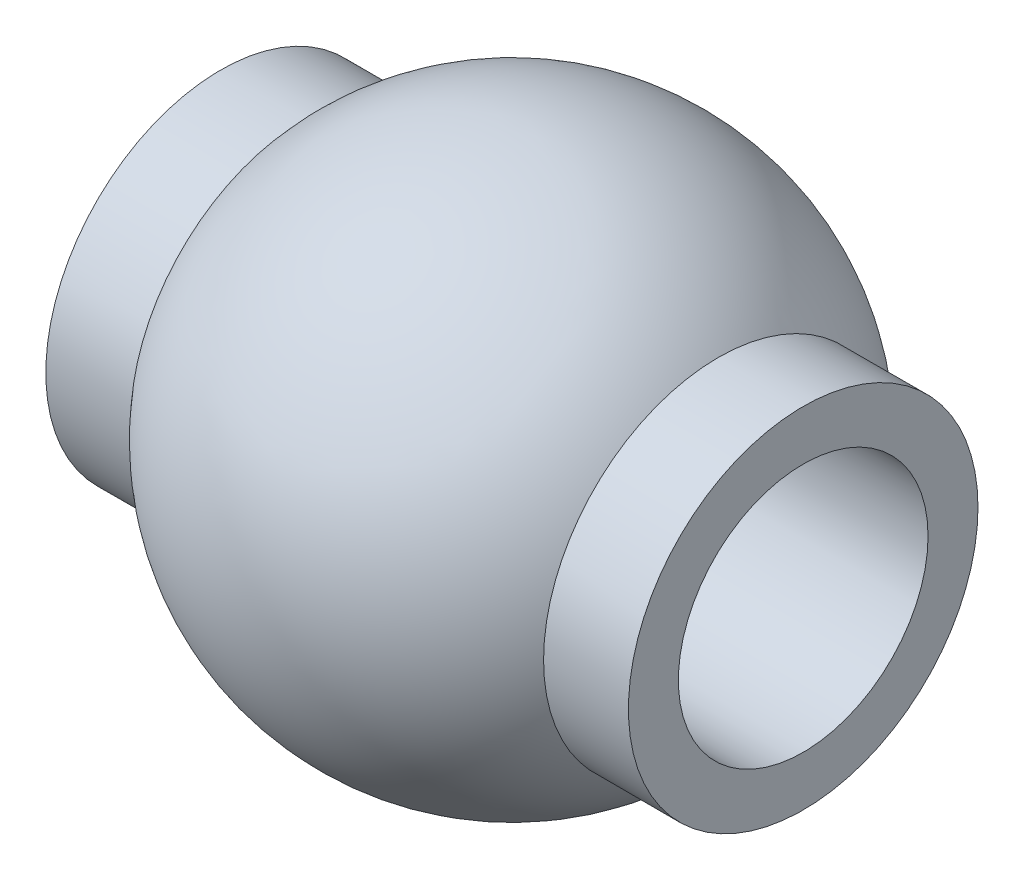
ISO-10303-21;
HEADER;
FILE_DESCRIPTION(('STEP AP214'),'2;1');
FILE_NAME('part.step','',(''),(''),'','','');
FILE_SCHEMA(('AUTOMOTIVE_DESIGN { 1 0 10303 214 1 1 1 1 }'));
ENDSEC;
DATA;
#1=APPLICATION_CONTEXT('core data for automotive mechanical design processes');
#2=APPLICATION_PROTOCOL_DEFINITION('international standard','automotive_design',2000,#1);
#3=PRODUCT_CONTEXT('',#1,'mechanical');
#4=PRODUCT('Part','Part','',(#3));
#5=PRODUCT_RELATED_PRODUCT_CATEGORY('part','',(#4));
#6=PRODUCT_DEFINITION_FORMATION('','',#4);
#7=PRODUCT_DEFINITION_CONTEXT('part definition',#1,'design');
#8=PRODUCT_DEFINITION('design','',#6,#7);
#9=PRODUCT_DEFINITION_SHAPE('','',#8);
#10=(LENGTH_UNIT() NAMED_UNIT(*) SI_UNIT(.MILLI.,.METRE.));
#11=(NAMED_UNIT(*) PLANE_ANGLE_UNIT() SI_UNIT($,.RADIAN.));
#12=(NAMED_UNIT(*) SI_UNIT($,.STERADIAN.) SOLID_ANGLE_UNIT());
#13=UNCERTAINTY_MEASURE_WITH_UNIT(LENGTH_MEASURE(1.E-05),#10,'distance_accuracy_value','');
#14=(GEOMETRIC_REPRESENTATION_CONTEXT(3) GLOBAL_UNCERTAINTY_ASSIGNED_CONTEXT((#13)) GLOBAL_UNIT_ASSIGNED_CONTEXT((#10,
#11,#12)) REPRESENTATION_CONTEXT('',''));
#15=CARTESIAN_POINT('',(0.,0.,0.));
#16=DIRECTION('',(0.,0.,1.));
#17=DIRECTION('',(1.,0.,0.));
#18=AXIS2_PLACEMENT_3D('',#15,#16,#17);
#19=CARTESIAN_POINT('',(0.,0.,0.));
#20=DIRECTION('',(0.,0.,-1.));
#21=DIRECTION('',(1.,0.,0.));
#22=AXIS2_PLACEMENT_3D('',#19,#20,#21);
#23=SPHERICAL_SURFACE('',#22,10.31875);
#24=CARTESIAN_POINT('',(0.,0.,0.));
#25=DIRECTION('',(-1.,0.,0.));
#26=DIRECTION('',(0.,0.,1.));
#27=AXIS2_PLACEMENT_3D('',#24,#25,#26);
#28=SPHERICAL_SURFACE('',#27,10.31875);
#29=CARTESIAN_POINT('',(7.87534413930591,0.,0.));
#30=DIRECTION('',(-1.,0.,0.));
#31=DIRECTION('',(0.,0.,1.));
#32=AXIS2_PLACEMENT_3D('',#29,#30,#31);
#33=CIRCLE('',#32,6.6675);
#34=CARTESIAN_POINT('',(7.87534413930591,0.,6.6675));
#35=VERTEX_POINT('',#34);
#36=EDGE_CURVE('E11',#35,#35,#33,.T.);
#37=ORIENTED_EDGE('',*,*,#36,.T.);
#38=EDGE_LOOP('',(#37));
#39=FACE_BOUND('',#38,.T.);
#40=CARTESIAN_POINT('',(-7.87534413930591,0.,0.));
#41=DIRECTION('',(1.,0.,0.));
#42=DIRECTION('',(0.,0.,-1.));
#43=AXIS2_PLACEMENT_3D('',#40,#41,#42);
#44=CIRCLE('',#43,6.6675);
#45=CARTESIAN_POINT('',(-7.87534413930591,0.,-6.6675));
#46=VERTEX_POINT('',#45);
#47=EDGE_CURVE('E55',#46,#46,#44,.T.);
#48=ORIENTED_EDGE('',*,*,#47,.T.);
#49=EDGE_LOOP('',(#48));
#50=FACE_BOUND('',#49,.T.);
#51=ADVANCED_FACE('F48',(#39,#50),#28,.T.);
#52=CARTESIAN_POINT('',(-11.1125,0.,0.));
#53=DIRECTION('',(1.,0.,0.));
#54=DIRECTION('',(0.,0.,-1.));
#55=AXIS2_PLACEMENT_3D('',#52,#53,#54);
#56=CYLINDRICAL_SURFACE('',#55,6.6675);
#57=CARTESIAN_POINT('',(-11.1125,0.,0.));
#58=DIRECTION('',(1.,0.,0.));
#59=DIRECTION('',(0.,0.,-1.));
#60=AXIS2_PLACEMENT_3D('',#57,#58,#59);
#61=CIRCLE('',#60,6.6675);
#62=CARTESIAN_POINT('',(-11.1125,0.,-6.6675));
#63=VERTEX_POINT('',#62);
#64=EDGE_CURVE('E61',#63,#63,#61,.T.);
#65=ORIENTED_EDGE('',*,*,#64,.T.);
#66=EDGE_LOOP('',(#65));
#67=FACE_BOUND('',#66,.T.);
#68=ORIENTED_EDGE('',*,*,#47,.F.);
#69=EDGE_LOOP('',(#68));
#70=FACE_BOUND('',#69,.T.);
#71=ADVANCED_FACE('F91',(#67,#70),#56,.T.);
#72=CARTESIAN_POINT('',(-11.1125,0.,0.));
#73=DIRECTION('',(1.,0.,0.));
#74=DIRECTION('',(0.,0.,-1.));
#75=AXIS2_PLACEMENT_3D('',#72,#73,#74);
#76=PLANE('',#75);
#77=CARTESIAN_POINT('',(-11.1125,0.,0.));
#78=DIRECTION('',(1.,0.,0.));
#79=DIRECTION('',(0.,0.,-1.));
#80=AXIS2_PLACEMENT_3D('',#77,#78,#79);
#81=CIRCLE('',#80,4.7625);
#82=CARTESIAN_POINT('',(-11.1125,0.,-4.7625));
#83=VERTEX_POINT('',#82);
#84=EDGE_CURVE('E65',#83,#83,#81,.T.);
#85=ORIENTED_EDGE('',*,*,#84,.T.);
#86=EDGE_LOOP('',(#85));
#87=FACE_BOUND('',#86,.T.);
#88=ORIENTED_EDGE('',*,*,#64,.F.);
#89=EDGE_LOOP('',(#88));
#90=FACE_BOUND('',#89,.T.);
#91=ADVANCED_FACE('F95',(#87,#90),#76,.F.);
#92=CARTESIAN_POINT('',(11.1125,0.,0.));
#93=DIRECTION('',(1.,0.,0.));
#94=DIRECTION('',(0.,0.,-1.));
#95=AXIS2_PLACEMENT_3D('',#92,#93,#94);
#96=CIRCLE('',#95,6.6675);
#97=CARTESIAN_POINT('',(11.1125,0.,-6.6675));
#98=VERTEX_POINT('',#97);
#99=EDGE_CURVE('E70',#98,#98,#96,.T.);
#100=ORIENTED_EDGE('',*,*,#99,.F.);
#101=EDGE_LOOP('',(#100));
#102=FACE_BOUND('',#101,.T.);
#103=ORIENTED_EDGE('',*,*,#36,.F.);
#104=EDGE_LOOP('',(#103));
#105=FACE_BOUND('',#104,.T.);
#106=ADVANCED_FACE('F88',(#102,#105),#56,.T.);
#107=CARTESIAN_POINT('',(-11.1125,0.,0.));
#108=DIRECTION('',(1.,0.,0.));
#109=DIRECTION('',(0.,0.,-1.));
#110=AXIS2_PLACEMENT_3D('',#107,#108,#109);
#111=CYLINDRICAL_SURFACE('',#110,4.7625);
#112=CARTESIAN_POINT('',(11.1125,0.,0.));
#113=DIRECTION('',(1.,0.,0.));
#114=DIRECTION('',(0.,0.,-1.));
#115=AXIS2_PLACEMENT_3D('',#112,#113,#114);
#116=CIRCLE('',#115,4.7625);
#117=CARTESIAN_POINT('',(11.1125,0.,-4.7625));
#118=VERTEX_POINT('',#117);
#119=EDGE_CURVE('E73',#118,#118,#116,.T.);
#120=ORIENTED_EDGE('',*,*,#119,.T.);
#121=EDGE_LOOP('',(#120));
#122=FACE_BOUND('',#121,.T.);
#123=ORIENTED_EDGE('',*,*,#84,.F.);
#124=EDGE_LOOP('',(#123));
#125=FACE_BOUND('',#124,.T.);
#126=ADVANCED_FACE('F78',(#122,#125),#111,.F.);
#127=CARTESIAN_POINT('',(11.1125,0.,0.));
#128=DIRECTION('',(1.,0.,0.));
#129=DIRECTION('',(0.,0.,-1.));
#130=AXIS2_PLACEMENT_3D('',#127,#128,#129);
#131=PLANE('',#130);
#132=ORIENTED_EDGE('',*,*,#99,.T.);
#133=EDGE_LOOP('',(#132));
#134=FACE_BOUND('',#133,.T.);
#135=ORIENTED_EDGE('',*,*,#119,.F.);
#136=EDGE_LOOP('',(#135));
#137=FACE_BOUND('',#136,.T.);
#138=ADVANCED_FACE('F81',(#134,#137),#131,.T.);
#139=CLOSED_SHELL('',(#51,#71,#91,#106,#126,#138));
#140=MANIFOLD_SOLID_BREP('B2',#139);
#141=ADVANCED_BREP_SHAPE_REPRESENTATION('',(#18,#140),#14);
#142=SHAPE_DEFINITION_REPRESENTATION(#9,#141);
ENDSEC;
END-ISO-10303-21;
